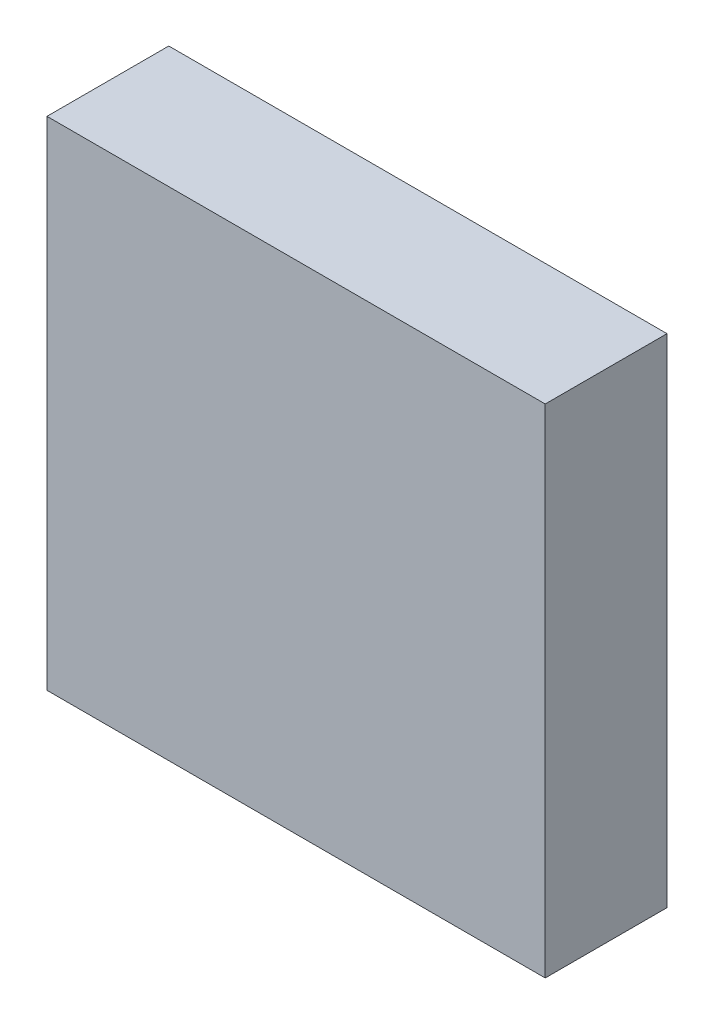
ISO-10303-21;
HEADER;
FILE_DESCRIPTION(('STEP AP214'),'2;1');
FILE_NAME('part.step','',(''),(''),'','','');
FILE_SCHEMA(('AUTOMOTIVE_DESIGN { 1 0 10303 214 1 1 1 1 }'));
ENDSEC;
DATA;
#1=APPLICATION_CONTEXT('core data for automotive mechanical design processes');
#2=APPLICATION_PROTOCOL_DEFINITION('international standard','automotive_design',2000,#1);
#3=PRODUCT_CONTEXT('',#1,'mechanical');
#4=PRODUCT('Part','Part','',(#3));
#5=PRODUCT_RELATED_PRODUCT_CATEGORY('part','',(#4));
#6=PRODUCT_DEFINITION_FORMATION('','',#4);
#7=PRODUCT_DEFINITION_CONTEXT('part definition',#1,'design');
#8=PRODUCT_DEFINITION('design','',#6,#7);
#9=PRODUCT_DEFINITION_SHAPE('','',#8);
#10=(LENGTH_UNIT() NAMED_UNIT(*) SI_UNIT(.MILLI.,.METRE.));
#11=(NAMED_UNIT(*) PLANE_ANGLE_UNIT() SI_UNIT($,.RADIAN.));
#12=(NAMED_UNIT(*) SI_UNIT($,.STERADIAN.) SOLID_ANGLE_UNIT());
#13=UNCERTAINTY_MEASURE_WITH_UNIT(LENGTH_MEASURE(1.E-05),#10,'distance_accuracy_value','');
#14=(GEOMETRIC_REPRESENTATION_CONTEXT(3) GLOBAL_UNCERTAINTY_ASSIGNED_CONTEXT((#13)) GLOBAL_UNIT_ASSIGNED_CONTEXT((#10,
#11,#12)) REPRESENTATION_CONTEXT('',''));
#15=CARTESIAN_POINT('',(0.,0.,0.));
#16=DIRECTION('',(0.,0.,1.));
#17=DIRECTION('',(1.,0.,0.));
#18=AXIS2_PLACEMENT_3D('',#15,#16,#17);
#19=CARTESIAN_POINT('',(22.5,22.45,11.));
#20=DIRECTION('',(-1.,0.,0.));
#21=DIRECTION('',(0.,-1.,0.));
#22=AXIS2_PLACEMENT_3D('',#19,#20,#21);
#23=PLANE('',#22);
#24=DIRECTION('',(0.,1.,0.));
#25=VECTOR('',#24,1.);
#26=CARTESIAN_POINT('',(22.5,22.45,0.));
#27=LINE('',#26,#25);
#28=CARTESIAN_POINT('',(22.5,-22.45,0.));
#29=VERTEX_POINT('',#28);
#30=CARTESIAN_POINT('',(22.5,22.45,0.));
#31=VERTEX_POINT('',#30);
#32=EDGE_CURVE('E110',#29,#31,#27,.T.);
#33=ORIENTED_EDGE('',*,*,#32,.T.);
#34=DIRECTION('',(0.,0.,-1.));
#35=VECTOR('',#34,1.);
#36=CARTESIAN_POINT('',(22.5,22.45,11.));
#37=LINE('',#36,#35);
#38=CARTESIAN_POINT('',(22.5,22.45,11.));
#39=VERTEX_POINT('',#38);
#40=EDGE_CURVE('E48',#39,#31,#37,.T.);
#41=ORIENTED_EDGE('',*,*,#40,.F.);
#42=DIRECTION('',(0.,1.,0.));
#43=VECTOR('',#42,1.);
#44=CARTESIAN_POINT('',(22.5,22.45,11.));
#45=LINE('',#44,#43);
#46=CARTESIAN_POINT('',(22.5,-22.45,11.));
#47=VERTEX_POINT('',#46);
#48=EDGE_CURVE('E92',#47,#39,#45,.T.);
#49=ORIENTED_EDGE('',*,*,#48,.F.);
#50=DIRECTION('',(0.,0.,-1.));
#51=VECTOR('',#50,1.);
#52=CARTESIAN_POINT('',(22.5,-22.45,11.));
#53=LINE('',#52,#51);
#54=EDGE_CURVE('E106',#47,#29,#53,.T.);
#55=ORIENTED_EDGE('',*,*,#54,.T.);
#56=EDGE_LOOP('',(#33,#41,#49,#55));
#57=FACE_BOUND('',#56,.T.);
#58=ADVANCED_FACE('F39',(#57),#23,.F.);
#59=CARTESIAN_POINT('',(-22.5,22.45,11.));
#60=DIRECTION('',(0.,-1.,0.));
#61=DIRECTION('',(0.,0.,-1.));
#62=AXIS2_PLACEMENT_3D('',#59,#60,#61);
#63=PLANE('',#62);
#64=DIRECTION('',(-1.,0.,0.));
#65=VECTOR('',#64,1.);
#66=CARTESIAN_POINT('',(-22.5,22.45,0.));
#67=LINE('',#66,#65);
#68=CARTESIAN_POINT('',(-22.5,22.45,0.));
#69=VERTEX_POINT('',#68);
#70=EDGE_CURVE('E98',#31,#69,#67,.T.);
#71=ORIENTED_EDGE('',*,*,#70,.T.);
#72=DIRECTION('',(0.,0.,-1.));
#73=VECTOR('',#72,1.);
#74=CARTESIAN_POINT('',(-22.5,22.45,11.));
#75=LINE('',#74,#73);
#76=CARTESIAN_POINT('',(-22.5,22.45,11.));
#77=VERTEX_POINT('',#76);
#78=EDGE_CURVE('E96',#77,#69,#75,.T.);
#79=ORIENTED_EDGE('',*,*,#78,.F.);
#80=DIRECTION('',(-1.,0.,0.));
#81=VECTOR('',#80,1.);
#82=CARTESIAN_POINT('',(-22.5,22.45,11.));
#83=LINE('',#82,#81);
#84=EDGE_CURVE('E87',#39,#77,#83,.T.);
#85=ORIENTED_EDGE('',*,*,#84,.F.);
#86=ORIENTED_EDGE('',*,*,#40,.T.);
#87=EDGE_LOOP('',(#71,#79,#85,#86));
#88=FACE_BOUND('',#87,.T.);
#89=ADVANCED_FACE('F97',(#88),#63,.F.);
#90=CARTESIAN_POINT('',(-22.5,22.45,11.));
#91=DIRECTION('',(1.,0.,0.));
#92=DIRECTION('',(0.,1.,0.));
#93=AXIS2_PLACEMENT_3D('',#90,#91,#92);
#94=PLANE('',#93);
#95=DIRECTION('',(0.,-1.,0.));
#96=VECTOR('',#95,1.);
#97=CARTESIAN_POINT('',(-22.5,22.45,0.));
#98=LINE('',#97,#96);
#99=CARTESIAN_POINT('',(-22.5,-22.45,0.));
#100=VERTEX_POINT('',#99);
#101=EDGE_CURVE('E73',#69,#100,#98,.T.);
#102=ORIENTED_EDGE('',*,*,#101,.T.);
#103=DIRECTION('',(0.,0.,-1.));
#104=VECTOR('',#103,1.);
#105=CARTESIAN_POINT('',(-22.5,-22.45,11.));
#106=LINE('',#105,#104);
#107=CARTESIAN_POINT('',(-22.5,-22.45,11.));
#108=VERTEX_POINT('',#107);
#109=EDGE_CURVE('E100',#108,#100,#106,.T.);
#110=ORIENTED_EDGE('',*,*,#109,.F.);
#111=DIRECTION('',(0.,-1.,0.));
#112=VECTOR('',#111,1.);
#113=CARTESIAN_POINT('',(-22.5,22.45,11.));
#114=LINE('',#113,#112);
#115=EDGE_CURVE('E90',#77,#108,#114,.T.);
#116=ORIENTED_EDGE('',*,*,#115,.F.);
#117=ORIENTED_EDGE('',*,*,#78,.T.);
#118=EDGE_LOOP('',(#102,#110,#116,#117));
#119=FACE_BOUND('',#118,.T.);
#120=ADVANCED_FACE('F102',(#119),#94,.F.);
#121=CARTESIAN_POINT('',(-22.5,-22.45,11.));
#122=DIRECTION('',(0.,1.,0.));
#123=DIRECTION('',(0.,0.,1.));
#124=AXIS2_PLACEMENT_3D('',#121,#122,#123);
#125=PLANE('',#124);
#126=DIRECTION('',(1.,0.,0.));
#127=VECTOR('',#126,1.);
#128=CARTESIAN_POINT('',(-22.5,-22.45,0.));
#129=LINE('',#128,#127);
#130=EDGE_CURVE('E79',#100,#29,#129,.T.);
#131=ORIENTED_EDGE('',*,*,#130,.T.);
#132=ORIENTED_EDGE('',*,*,#54,.F.);
#133=DIRECTION('',(1.,0.,0.));
#134=VECTOR('',#133,1.);
#135=CARTESIAN_POINT('',(-22.5,-22.45,11.));
#136=LINE('',#135,#134);
#137=EDGE_CURVE('E56',#108,#47,#136,.T.);
#138=ORIENTED_EDGE('',*,*,#137,.F.);
#139=ORIENTED_EDGE('',*,*,#109,.T.);
#140=EDGE_LOOP('',(#131,#132,#138,#139));
#141=FACE_BOUND('',#140,.T.);
#142=ADVANCED_FACE('F140',(#141),#125,.F.);
#143=CARTESIAN_POINT('',(0.,0.,11.));
#144=DIRECTION('',(0.,0.,1.));
#145=DIRECTION('',(1.,0.,0.));
#146=AXIS2_PLACEMENT_3D('',#143,#144,#145);
#147=PLANE('',#146);
#148=ORIENTED_EDGE('',*,*,#48,.T.);
#149=ORIENTED_EDGE('',*,*,#84,.T.);
#150=ORIENTED_EDGE('',*,*,#115,.T.);
#151=ORIENTED_EDGE('',*,*,#137,.T.);
#152=EDGE_LOOP('',(#148,#149,#150,#151));
#153=FACE_BOUND('',#152,.T.);
#154=ADVANCED_FACE('F88',(#153),#147,.T.);
#155=CARTESIAN_POINT('',(0.,0.,0.));
#156=DIRECTION('',(0.,0.,1.));
#157=DIRECTION('',(1.,0.,0.));
#158=AXIS2_PLACEMENT_3D('',#155,#156,#157);
#159=PLANE('',#158);
#160=CARTESIAN_POINT('',(0.,0.,0.));
#161=DIRECTION('',(0.,0.,-1.));
#162=DIRECTION('',(-1.,0.,0.));
#163=AXIS2_PLACEMENT_3D('',#160,#161,#162);
#164=CIRCLE('',#163,15.75);
#165=CARTESIAN_POINT('',(-15.75,0.,0.));
#166=VERTEX_POINT('',#165);
#167=EDGE_CURVE('E234',#166,#166,#164,.T.);
#168=ORIENTED_EDGE('',*,*,#167,.F.);
#169=EDGE_LOOP('',(#168));
#170=FACE_BOUND('',#169,.T.);
#171=ORIENTED_EDGE('',*,*,#32,.F.);
#172=ORIENTED_EDGE('',*,*,#130,.F.);
#173=ORIENTED_EDGE('',*,*,#101,.F.);
#174=ORIENTED_EDGE('',*,*,#70,.F.);
#175=EDGE_LOOP('',(#171,#172,#173,#174));
#176=FACE_BOUND('',#175,.T.);
#177=ADVANCED_FACE('F128',(#170,#176),#159,.F.);
#178=CARTESIAN_POINT('',(0.,0.,10.));
#179=DIRECTION('',(0.,0.,-1.));
#180=DIRECTION('',(-1.,0.,0.));
#181=AXIS2_PLACEMENT_3D('',#178,#179,#180);
#182=CYLINDRICAL_SURFACE('',#181,15.75);
#183=CARTESIAN_POINT('',(0.,0.,10.));
#184=DIRECTION('',(0.,0.,-1.));
#185=DIRECTION('',(-1.,0.,0.));
#186=AXIS2_PLACEMENT_3D('',#183,#184,#185);
#187=CIRCLE('',#186,15.75);
#188=CARTESIAN_POINT('',(-15.75,0.,10.));
#189=VERTEX_POINT('',#188);
#190=EDGE_CURVE('E114',#189,#189,#187,.T.);
#191=ORIENTED_EDGE('',*,*,#190,.F.);
#192=EDGE_LOOP('',(#191));
#193=FACE_BOUND('',#192,.T.);
#194=ORIENTED_EDGE('',*,*,#167,.T.);
#195=EDGE_LOOP('',(#194));
#196=FACE_BOUND('',#195,.T.);
#197=ADVANCED_FACE('F130',(#193,#196),#182,.F.);
#198=CARTESIAN_POINT('',(0.,0.,10.));
#199=DIRECTION('',(0.,0.,-1.));
#200=DIRECTION('',(-1.,0.,0.));
#201=AXIS2_PLACEMENT_3D('',#198,#199,#200);
#202=PLANE('',#201);
#203=CARTESIAN_POINT('',(0.,0.,10.));
#204=DIRECTION('',(0.,0.,-1.));
#205=DIRECTION('',(-1.,0.,0.));
#206=AXIS2_PLACEMENT_3D('',#203,#204,#205);
#207=CIRCLE('',#206,11.5);
#208=CARTESIAN_POINT('',(-11.5,0.,10.));
#209=VERTEX_POINT('',#208);
#210=EDGE_CURVE('E11',#209,#209,#207,.T.);
#211=ORIENTED_EDGE('',*,*,#210,.F.);
#212=EDGE_LOOP('',(#211));
#213=FACE_BOUND('',#212,.T.);
#214=ORIENTED_EDGE('',*,*,#190,.T.);
#215=EDGE_LOOP('',(#214));
#216=FACE_BOUND('',#215,.T.);
#217=ADVANCED_FACE('F137',(#213,#216),#202,.T.);
#218=CARTESIAN_POINT('',(0.,0.,10.));
#219=DIRECTION('',(0.,0.,-1.));
#220=DIRECTION('',(-1.,0.,0.));
#221=AXIS2_PLACEMENT_3D('',#218,#219,#220);
#222=CYLINDRICAL_SURFACE('',#221,11.5);
#223=ORIENTED_EDGE('',*,*,#210,.T.);
#224=EDGE_LOOP('',(#223));
#225=FACE_BOUND('',#224,.T.);
#226=CARTESIAN_POINT('',(0.,0.,0.));
#227=DIRECTION('',(0.,0.,-1.));
#228=DIRECTION('',(-1.,0.,0.));
#229=AXIS2_PLACEMENT_3D('',#226,#227,#228);
#230=CIRCLE('',#229,11.5);
#231=CARTESIAN_POINT('',(-11.5,0.,0.));
#232=VERTEX_POINT('',#231);
#233=EDGE_CURVE('E228',#232,#232,#230,.T.);
#234=ORIENTED_EDGE('',*,*,#233,.F.);
#235=EDGE_LOOP('',(#234));
#236=FACE_BOUND('',#235,.T.);
#237=ADVANCED_FACE('F180',(#225,#236),#222,.T.);
#238=CARTESIAN_POINT('',(0.,0.,0.));
#239=DIRECTION('',(0.,0.,-1.));
#240=DIRECTION('',(-1.,0.,0.));
#241=AXIS2_PLACEMENT_3D('',#238,#239,#240);
#242=PLANE('',#241);
#243=CARTESIAN_POINT('',(0.,0.,0.));
#244=DIRECTION('',(0.,0.,-1.));
#245=DIRECTION('',(-1.,0.,0.));
#246=AXIS2_PLACEMENT_3D('',#243,#244,#245);
#247=CIRCLE('',#246,11.);
#248=CARTESIAN_POINT('',(-11.,0.,0.));
#249=VERTEX_POINT('',#248);
#250=EDGE_CURVE('E229',#249,#249,#247,.T.);
#251=ORIENTED_EDGE('',*,*,#250,.F.);
#252=EDGE_LOOP('',(#251));
#253=FACE_BOUND('',#252,.T.);
#254=ORIENTED_EDGE('',*,*,#233,.T.);
#255=EDGE_LOOP('',(#254));
#256=FACE_BOUND('',#255,.T.);
#257=ADVANCED_FACE('F190',(#253,#256),#242,.T.);
#258=CARTESIAN_POINT('',(0.,0.,7.));
#259=DIRECTION('',(0.,0.,-1.));
#260=DIRECTION('',(-1.,0.,0.));
#261=AXIS2_PLACEMENT_3D('',#258,#259,#260);
#262=CYLINDRICAL_SURFACE('',#261,11.);
#263=CARTESIAN_POINT('',(0.,0.,7.));
#264=DIRECTION('',(0.,0.,-1.));
#265=DIRECTION('',(-1.,0.,0.));
#266=AXIS2_PLACEMENT_3D('',#263,#264,#265);
#267=CIRCLE('',#266,11.);
#268=CARTESIAN_POINT('',(-11.,0.,7.));
#269=VERTEX_POINT('',#268);
#270=EDGE_CURVE('E226',#269,#269,#267,.T.);
#271=ORIENTED_EDGE('',*,*,#270,.F.);
#272=EDGE_LOOP('',(#271));
#273=FACE_BOUND('',#272,.T.);
#274=ORIENTED_EDGE('',*,*,#250,.T.);
#275=EDGE_LOOP('',(#274));
#276=FACE_BOUND('',#275,.T.);
#277=ADVANCED_FACE('F200',(#273,#276),#262,.F.);
#278=CARTESIAN_POINT('',(0.,0.,7.));
#279=DIRECTION('',(0.,0.,-1.));
#280=DIRECTION('',(-1.,0.,0.));
#281=AXIS2_PLACEMENT_3D('',#278,#279,#280);
#282=PLANE('',#281);
#283=ORIENTED_EDGE('',*,*,#270,.T.);
#284=EDGE_LOOP('',(#283));
#285=FACE_BOUND('',#284,.T.);
#286=ADVANCED_FACE('F210',(#285),#282,.T.);
#287=CLOSED_SHELL('',(#58,#89,#120,#142,#154,#177,#197,#217,#237,#257,#277,#286));
#288=MANIFOLD_SOLID_BREP('B2',#287);
#289=ADVANCED_BREP_SHAPE_REPRESENTATION('',(#18,#288),#14);
#290=SHAPE_DEFINITION_REPRESENTATION(#9,#289);
ENDSEC;
END-ISO-10303-21;
